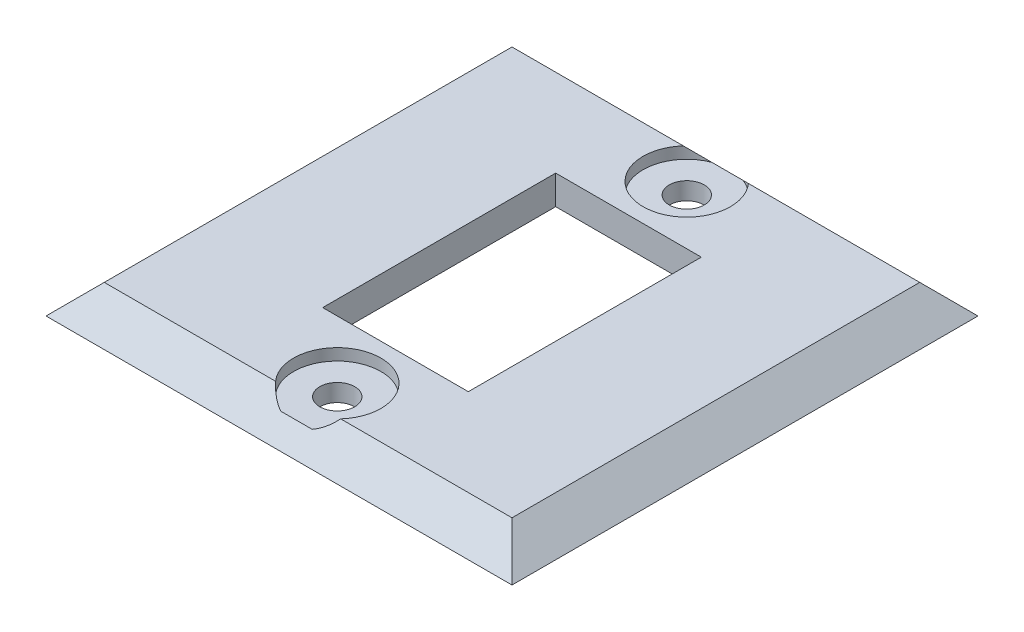
ISO-10303-21;
HEADER;
FILE_DESCRIPTION(('STEP AP214'),'2;1');
FILE_NAME('part.step','',(''),(''),'','','');
FILE_SCHEMA(('AUTOMOTIVE_DESIGN { 1 0 10303 214 1 1 1 1 }'));
ENDSEC;
DATA;
#1=APPLICATION_CONTEXT('core data for automotive mechanical design processes');
#2=APPLICATION_PROTOCOL_DEFINITION('international standard','automotive_design',2000,#1);
#3=PRODUCT_CONTEXT('',#1,'mechanical');
#4=PRODUCT('Part','Part','',(#3));
#5=PRODUCT_RELATED_PRODUCT_CATEGORY('part','',(#4));
#6=PRODUCT_DEFINITION_FORMATION('','',#4);
#7=PRODUCT_DEFINITION_CONTEXT('part definition',#1,'design');
#8=PRODUCT_DEFINITION('design','',#6,#7);
#9=PRODUCT_DEFINITION_SHAPE('','',#8);
#10=(LENGTH_UNIT() NAMED_UNIT(*) SI_UNIT(.MILLI.,.METRE.));
#11=(NAMED_UNIT(*) PLANE_ANGLE_UNIT() SI_UNIT($,.RADIAN.));
#12=(NAMED_UNIT(*) SI_UNIT($,.STERADIAN.) SOLID_ANGLE_UNIT());
#13=UNCERTAINTY_MEASURE_WITH_UNIT(LENGTH_MEASURE(1.E-05),#10,'distance_accuracy_value','');
#14=(GEOMETRIC_REPRESENTATION_CONTEXT(3) GLOBAL_UNCERTAINTY_ASSIGNED_CONTEXT((#13)) GLOBAL_UNIT_ASSIGNED_CONTEXT((#10,
#11,#12)) REPRESENTATION_CONTEXT('',''));
#15=CARTESIAN_POINT('',(0.,0.,0.));
#16=DIRECTION('',(0.,0.,1.));
#17=DIRECTION('',(1.,0.,0.));
#18=AXIS2_PLACEMENT_3D('',#15,#16,#17);
#19=CARTESIAN_POINT('',(0.,-7.5,15.));
#20=DIRECTION('',(0.,1.,0.));
#21=DIRECTION('',(0.,0.,1.));
#22=AXIS2_PLACEMENT_3D('',#19,#20,#21);
#23=CYLINDRICAL_SURFACE('',#22,1.5);
#24=CARTESIAN_POINT('',(0.,0.,15.));
#25=DIRECTION('',(0.,1.,0.));
#26=DIRECTION('',(0.,0.,1.));
#27=AXIS2_PLACEMENT_3D('',#24,#25,#26);
#28=CIRCLE('',#27,1.5);
#29=CARTESIAN_POINT('',(0.,0.,16.5));
#30=VERTEX_POINT('',#29);
#31=EDGE_CURVE('E183',#30,#30,#28,.T.);
#32=ORIENTED_EDGE('',*,*,#31,.F.);
#33=EDGE_LOOP('',(#32));
#34=FACE_BOUND('',#33,.T.);
#35=CARTESIAN_POINT('',(0.,1.5,15.));
#36=DIRECTION('',(0.,1.,0.));
#37=DIRECTION('',(0.,0.,1.));
#38=AXIS2_PLACEMENT_3D('',#35,#36,#37);
#39=CIRCLE('',#38,1.5);
#40=CARTESIAN_POINT('',(0.,1.5,16.5));
#41=VERTEX_POINT('',#40);
#42=EDGE_CURVE('E190',#41,#41,#39,.F.);
#43=ORIENTED_EDGE('',*,*,#42,.F.);
#44=EDGE_LOOP('',(#43));
#45=FACE_BOUND('',#44,.T.);
#46=ADVANCED_FACE('F35',(#34,#45),#23,.F.);
#47=CARTESIAN_POINT('',(0.,-7.5,-15.));
#48=DIRECTION('',(0.,1.,0.));
#49=DIRECTION('',(0.,0.,1.));
#50=AXIS2_PLACEMENT_3D('',#47,#48,#49);
#51=CYLINDRICAL_SURFACE('',#50,1.5);
#52=CARTESIAN_POINT('',(0.,0.,-15.));
#53=DIRECTION('',(0.,1.,0.));
#54=DIRECTION('',(0.,0.,1.));
#55=AXIS2_PLACEMENT_3D('',#52,#53,#54);
#56=CIRCLE('',#55,1.5);
#57=CARTESIAN_POINT('',(0.,0.,-13.5));
#58=VERTEX_POINT('',#57);
#59=EDGE_CURVE('E158',#58,#58,#56,.T.);
#60=ORIENTED_EDGE('',*,*,#59,.F.);
#61=EDGE_LOOP('',(#60));
#62=FACE_BOUND('',#61,.T.);
#63=CARTESIAN_POINT('',(0.,1.5,-15.));
#64=DIRECTION('',(0.,1.,0.));
#65=DIRECTION('',(0.,0.,1.));
#66=AXIS2_PLACEMENT_3D('',#63,#64,#65);
#67=CIRCLE('',#66,1.5);
#68=CARTESIAN_POINT('',(0.,1.5,-13.5));
#69=VERTEX_POINT('',#68);
#70=EDGE_CURVE('E186',#69,#69,#67,.F.);
#71=ORIENTED_EDGE('',*,*,#70,.F.);
#72=EDGE_LOOP('',(#71));
#73=FACE_BOUND('',#72,.T.);
#74=ADVANCED_FACE('F277',(#62,#73),#51,.F.);
#75=CARTESIAN_POINT('',(0.,2.5,0.));
#76=DIRECTION('',(0.,1.,0.));
#77=DIRECTION('',(0.,0.,1.));
#78=AXIS2_PLACEMENT_3D('',#75,#76,#77);
#79=PLANE('',#78);
#80=CARTESIAN_POINT('',(0.,2.5,15.));
#81=DIRECTION('',(0.,1.,0.));
#82=DIRECTION('',(0.,0.,1.));
#83=AXIS2_PLACEMENT_3D('',#80,#81,#82);
#84=CIRCLE('',#83,3.75);
#85=CARTESIAN_POINT('',(2.79508497187475,2.5,17.5));
#86=VERTEX_POINT('',#85);
#87=CARTESIAN_POINT('',(-2.79508497187475,2.5,17.5));
#88=VERTEX_POINT('',#87);
#89=EDGE_CURVE('E225',#86,#88,#84,.T.);
#90=ORIENTED_EDGE('',*,*,#89,.F.);
#91=DIRECTION('',(1.,0.,0.));
#92=VECTOR('',#91,1.);
#93=CARTESIAN_POINT('',(-20.,2.5,17.5));
#94=LINE('',#93,#92);
#95=CARTESIAN_POINT('',(17.5,2.5,17.5));
#96=VERTEX_POINT('',#95);
#97=EDGE_CURVE('E205',#86,#96,#94,.T.);
#98=ORIENTED_EDGE('',*,*,#97,.T.);
#99=DIRECTION('',(0.,0.,-1.));
#100=VECTOR('',#99,1.);
#101=CARTESIAN_POINT('',(17.5,2.5,-20.));
#102=LINE('',#101,#100);
#103=CARTESIAN_POINT('',(17.5,2.5,-17.5));
#104=VERTEX_POINT('',#103);
#105=EDGE_CURVE('E202',#96,#104,#102,.T.);
#106=ORIENTED_EDGE('',*,*,#105,.T.);
#107=DIRECTION('',(-1.,0.,0.));
#108=VECTOR('',#107,1.);
#109=CARTESIAN_POINT('',(20.,2.5,-17.5));
#110=LINE('',#109,#108);
#111=CARTESIAN_POINT('',(2.79508497187474,2.5,-17.5));
#112=VERTEX_POINT('',#111);
#113=EDGE_CURVE('E200',#104,#112,#110,.T.);
#114=ORIENTED_EDGE('',*,*,#113,.T.);
#115=CARTESIAN_POINT('',(0.,2.5,-15.));
#116=DIRECTION('',(0.,1.,0.));
#117=DIRECTION('',(0.,0.,1.));
#118=AXIS2_PLACEMENT_3D('',#115,#116,#117);
#119=CIRCLE('',#118,3.75);
#120=CARTESIAN_POINT('',(-2.79508497187474,2.5,-17.5));
#121=VERTEX_POINT('',#120);
#122=EDGE_CURVE('E193',#121,#112,#119,.T.);
#123=ORIENTED_EDGE('',*,*,#122,.F.);
#124=DIRECTION('',(-1.,0.,0.));
#125=VECTOR('',#124,1.);
#126=CARTESIAN_POINT('',(20.,2.5,-17.5));
#127=LINE('',#126,#125);
#128=CARTESIAN_POINT('',(-17.5,2.5,-17.5));
#129=VERTEX_POINT('',#128);
#130=EDGE_CURVE('E196',#121,#129,#127,.T.);
#131=ORIENTED_EDGE('',*,*,#130,.T.);
#132=DIRECTION('',(0.,0.,1.));
#133=VECTOR('',#132,1.);
#134=CARTESIAN_POINT('',(-17.5,2.5,20.));
#135=LINE('',#134,#133);
#136=CARTESIAN_POINT('',(-17.5,2.5,17.5));
#137=VERTEX_POINT('',#136);
#138=EDGE_CURVE('E180',#129,#137,#135,.T.);
#139=ORIENTED_EDGE('',*,*,#138,.T.);
#140=DIRECTION('',(1.,0.,0.));
#141=VECTOR('',#140,1.);
#142=CARTESIAN_POINT('',(-20.,2.5,17.5));
#143=LINE('',#142,#141);
#144=EDGE_CURVE('E198',#137,#88,#143,.T.);
#145=ORIENTED_EDGE('',*,*,#144,.T.);
#146=EDGE_LOOP('',(#90,#98,#106,#114,#123,#131,#139,#145));
#147=FACE_BOUND('',#146,.T.);
#148=DIRECTION('',(1.,0.,0.));
#149=VECTOR('',#148,1.);
#150=CARTESIAN_POINT('',(-6.25,2.5,10.));
#151=LINE('',#150,#149);
#152=CARTESIAN_POINT('',(-6.25,2.5,10.));
#153=VERTEX_POINT('',#152);
#154=CARTESIAN_POINT('',(6.25,2.5,10.));
#155=VERTEX_POINT('',#154);
#156=EDGE_CURVE('E135',#153,#155,#151,.T.);
#157=ORIENTED_EDGE('',*,*,#156,.F.);
#158=DIRECTION('',(0.,0.,1.));
#159=VECTOR('',#158,1.);
#160=CARTESIAN_POINT('',(-6.25,2.5,-10.));
#161=LINE('',#160,#159);
#162=CARTESIAN_POINT('',(-6.25,2.5,-10.));
#163=VERTEX_POINT('',#162);
#164=EDGE_CURVE('E125',#163,#153,#161,.T.);
#165=ORIENTED_EDGE('',*,*,#164,.F.);
#166=DIRECTION('',(-1.,0.,0.));
#167=VECTOR('',#166,1.);
#168=CARTESIAN_POINT('',(-6.25,2.5,-10.));
#169=LINE('',#168,#167);
#170=CARTESIAN_POINT('',(6.25,2.5,-10.));
#171=VERTEX_POINT('',#170);
#172=EDGE_CURVE('E151',#171,#163,#169,.T.);
#173=ORIENTED_EDGE('',*,*,#172,.F.);
#174=DIRECTION('',(0.,0.,-1.));
#175=VECTOR('',#174,1.);
#176=CARTESIAN_POINT('',(6.25,2.5,-10.));
#177=LINE('',#176,#175);
#178=EDGE_CURVE('E149',#155,#171,#177,.T.);
#179=ORIENTED_EDGE('',*,*,#178,.F.);
#180=EDGE_LOOP('',(#157,#165,#173,#179));
#181=FACE_BOUND('',#180,.T.);
#182=ADVANCED_FACE('F147',(#147,#181),#79,.T.);
#183=CARTESIAN_POINT('',(0.,0.,0.));
#184=DIRECTION('',(0.,1.,0.));
#185=DIRECTION('',(0.,0.,1.));
#186=AXIS2_PLACEMENT_3D('',#183,#184,#185);
#187=PLANE('',#186);
#188=ORIENTED_EDGE('',*,*,#31,.T.);
#189=EDGE_LOOP('',(#188));
#190=FACE_BOUND('',#189,.T.);
#191=ORIENTED_EDGE('',*,*,#59,.T.);
#192=EDGE_LOOP('',(#191));
#193=FACE_BOUND('',#192,.T.);
#194=DIRECTION('',(0.,0.,1.));
#195=VECTOR('',#194,1.);
#196=CARTESIAN_POINT('',(-20.,0.,-20.));
#197=LINE('',#196,#195);
#198=CARTESIAN_POINT('',(-20.,0.,-20.));
#199=VERTEX_POINT('',#198);
#200=CARTESIAN_POINT('',(-20.,0.,20.));
#201=VERTEX_POINT('',#200);
#202=EDGE_CURVE('E143',#199,#201,#197,.T.);
#203=ORIENTED_EDGE('',*,*,#202,.F.);
#204=DIRECTION('',(-1.,0.,0.));
#205=VECTOR('',#204,1.);
#206=CARTESIAN_POINT('',(-20.,0.,-20.));
#207=LINE('',#206,#205);
#208=CARTESIAN_POINT('',(20.,0.,-20.));
#209=VERTEX_POINT('',#208);
#210=EDGE_CURVE('E177',#209,#199,#207,.T.);
#211=ORIENTED_EDGE('',*,*,#210,.F.);
#212=DIRECTION('',(0.,0.,-1.));
#213=VECTOR('',#212,1.);
#214=CARTESIAN_POINT('',(20.,0.,-20.));
#215=LINE('',#214,#213);
#216=CARTESIAN_POINT('',(20.,0.,20.));
#217=VERTEX_POINT('',#216);
#218=EDGE_CURVE('E174',#217,#209,#215,.T.);
#219=ORIENTED_EDGE('',*,*,#218,.F.);
#220=DIRECTION('',(1.,0.,0.));
#221=VECTOR('',#220,1.);
#222=CARTESIAN_POINT('',(-20.,0.,20.));
#223=LINE('',#222,#221);
#224=EDGE_CURVE('E171',#201,#217,#223,.T.);
#225=ORIENTED_EDGE('',*,*,#224,.F.);
#226=EDGE_LOOP('',(#203,#211,#219,#225));
#227=FACE_BOUND('',#226,.T.);
#228=DIRECTION('',(0.,0.,1.));
#229=VECTOR('',#228,1.);
#230=CARTESIAN_POINT('',(-6.25,0.,-10.));
#231=LINE('',#230,#229);
#232=CARTESIAN_POINT('',(-6.25,0.,-10.));
#233=VERTEX_POINT('',#232);
#234=CARTESIAN_POINT('',(-6.25,0.,10.));
#235=VERTEX_POINT('',#234);
#236=EDGE_CURVE('E156',#233,#235,#231,.T.);
#237=ORIENTED_EDGE('',*,*,#236,.T.);
#238=DIRECTION('',(1.,0.,0.));
#239=VECTOR('',#238,1.);
#240=CARTESIAN_POINT('',(-6.25,0.,10.));
#241=LINE('',#240,#239);
#242=CARTESIAN_POINT('',(6.25,0.,10.));
#243=VERTEX_POINT('',#242);
#244=EDGE_CURVE('E142',#235,#243,#241,.T.);
#245=ORIENTED_EDGE('',*,*,#244,.T.);
#246=DIRECTION('',(0.,0.,-1.));
#247=VECTOR('',#246,1.);
#248=CARTESIAN_POINT('',(6.25,0.,-10.));
#249=LINE('',#248,#247);
#250=CARTESIAN_POINT('',(6.25,0.,-10.));
#251=VERTEX_POINT('',#250);
#252=EDGE_CURVE('E160',#243,#251,#249,.T.);
#253=ORIENTED_EDGE('',*,*,#252,.T.);
#254=DIRECTION('',(-1.,0.,0.));
#255=VECTOR('',#254,1.);
#256=CARTESIAN_POINT('',(-6.25,0.,-10.));
#257=LINE('',#256,#255);
#258=EDGE_CURVE('E136',#251,#233,#257,.T.);
#259=ORIENTED_EDGE('',*,*,#258,.T.);
#260=EDGE_LOOP('',(#237,#245,#253,#259));
#261=FACE_BOUND('',#260,.T.);
#262=ADVANCED_FACE('F256',(#190,#193,#227,#261),#187,.F.);
#263=CARTESIAN_POINT('',(-6.25,2.5,-10.));
#264=DIRECTION('',(1.,0.,0.));
#265=DIRECTION('',(0.,0.,-1.));
#266=AXIS2_PLACEMENT_3D('',#263,#264,#265);
#267=PLANE('',#266);
#268=ORIENTED_EDGE('',*,*,#236,.F.);
#269=DIRECTION('',(0.,-1.,0.));
#270=VECTOR('',#269,1.);
#271=CARTESIAN_POINT('',(-6.25,2.5,-10.));
#272=LINE('',#271,#270);
#273=EDGE_CURVE('E131',#163,#233,#272,.T.);
#274=ORIENTED_EDGE('',*,*,#273,.F.);
#275=ORIENTED_EDGE('',*,*,#164,.T.);
#276=DIRECTION('',(0.,-1.,0.));
#277=VECTOR('',#276,1.);
#278=CARTESIAN_POINT('',(-6.25,2.5,10.));
#279=LINE('',#278,#277);
#280=EDGE_CURVE('E128',#153,#235,#279,.T.);
#281=ORIENTED_EDGE('',*,*,#280,.T.);
#282=EDGE_LOOP('',(#268,#274,#275,#281));
#283=FACE_BOUND('',#282,.T.);
#284=ADVANCED_FACE('F127',(#283),#267,.T.);
#285=CARTESIAN_POINT('',(-6.25,2.5,10.));
#286=DIRECTION('',(0.,0.,-1.));
#287=DIRECTION('',(-1.,0.,0.));
#288=AXIS2_PLACEMENT_3D('',#285,#286,#287);
#289=PLANE('',#288);
#290=ORIENTED_EDGE('',*,*,#244,.F.);
#291=ORIENTED_EDGE('',*,*,#280,.F.);
#292=ORIENTED_EDGE('',*,*,#156,.T.);
#293=DIRECTION('',(0.,-1.,0.));
#294=VECTOR('',#293,1.);
#295=CARTESIAN_POINT('',(6.25,2.5,10.));
#296=LINE('',#295,#294);
#297=EDGE_CURVE('E144',#155,#243,#296,.T.);
#298=ORIENTED_EDGE('',*,*,#297,.T.);
#299=EDGE_LOOP('',(#290,#291,#292,#298));
#300=FACE_BOUND('',#299,.T.);
#301=ADVANCED_FACE('F139',(#300),#289,.T.);
#302=CARTESIAN_POINT('',(6.25,2.5,-10.));
#303=DIRECTION('',(-1.,0.,0.));
#304=DIRECTION('',(0.,0.,1.));
#305=AXIS2_PLACEMENT_3D('',#302,#303,#304);
#306=PLANE('',#305);
#307=ORIENTED_EDGE('',*,*,#252,.F.);
#308=ORIENTED_EDGE('',*,*,#297,.F.);
#309=ORIENTED_EDGE('',*,*,#178,.T.);
#310=DIRECTION('',(0.,-1.,0.));
#311=VECTOR('',#310,1.);
#312=CARTESIAN_POINT('',(6.25,2.5,-10.));
#313=LINE('',#312,#311);
#314=EDGE_CURVE('E166',#171,#251,#313,.T.);
#315=ORIENTED_EDGE('',*,*,#314,.T.);
#316=EDGE_LOOP('',(#307,#308,#309,#315));
#317=FACE_BOUND('',#316,.T.);
#318=ADVANCED_FACE('F266',(#317),#306,.T.);
#319=CARTESIAN_POINT('',(-6.25,2.5,-10.));
#320=DIRECTION('',(0.,0.,1.));
#321=DIRECTION('',(1.,0.,0.));
#322=AXIS2_PLACEMENT_3D('',#319,#320,#321);
#323=PLANE('',#322);
#324=ORIENTED_EDGE('',*,*,#258,.F.);
#325=ORIENTED_EDGE('',*,*,#314,.F.);
#326=ORIENTED_EDGE('',*,*,#172,.T.);
#327=ORIENTED_EDGE('',*,*,#273,.T.);
#328=EDGE_LOOP('',(#324,#325,#326,#327));
#329=FACE_BOUND('',#328,.T.);
#330=ADVANCED_FACE('F263',(#329),#323,.T.);
#331=CARTESIAN_POINT('',(0.,1.5,-15.));
#332=DIRECTION('',(0.,1.,0.));
#333=DIRECTION('',(0.,0.,1.));
#334=AXIS2_PLACEMENT_3D('',#331,#332,#333);
#335=PLANE('',#334);
#336=CARTESIAN_POINT('',(0.,1.5,-15.));
#337=DIRECTION('',(0.,1.,0.));
#338=DIRECTION('',(0.,0.,1.));
#339=AXIS2_PLACEMENT_3D('',#336,#337,#338);
#340=CIRCLE('',#339,3.75);
#341=CARTESIAN_POINT('',(-1.34629120178364,1.5,-18.5));
#342=VERTEX_POINT('',#341);
#343=CARTESIAN_POINT('',(1.34629120178364,1.5,-18.5));
#344=VERTEX_POINT('',#343);
#345=EDGE_CURVE('E189',#342,#344,#340,.T.);
#346=ORIENTED_EDGE('',*,*,#345,.T.);
#347=DIRECTION('',(-1.,0.,0.));
#348=VECTOR('',#347,1.);
#349=CARTESIAN_POINT('',(0.,1.5,-18.5));
#350=LINE('',#349,#348);
#351=EDGE_CURVE('E11',#344,#342,#350,.T.);
#352=ORIENTED_EDGE('',*,*,#351,.T.);
#353=EDGE_LOOP('',(#346,#352));
#354=FACE_BOUND('',#353,.T.);
#355=ORIENTED_EDGE('',*,*,#70,.T.);
#356=EDGE_LOOP('',(#355));
#357=FACE_BOUND('',#356,.T.);
#358=ADVANCED_FACE('F273',(#354,#357),#335,.T.);
#359=CARTESIAN_POINT('',(0.,1.5,-15.));
#360=DIRECTION('',(0.,1.,0.));
#361=DIRECTION('',(0.,0.,1.));
#362=AXIS2_PLACEMENT_3D('',#359,#360,#361);
#363=CYLINDRICAL_SURFACE('',#362,3.75);
#364=ORIENTED_EDGE('',*,*,#122,.T.);
#365=CARTESIAN_POINT('',(0.,5.,-15.));
#366=DIRECTION('',(0.,0.707106781186547,-0.707106781186547));
#367=DIRECTION('',(0.,0.707106781186548,0.707106781186548));
#368=AXIS2_PLACEMENT_3D('',#365,#366,#367);
#369=ELLIPSE('',#368,5.30330085889911,3.75);
#370=EDGE_CURVE('E44',#112,#344,#369,.T.);
#371=ORIENTED_EDGE('',*,*,#370,.T.);
#372=ORIENTED_EDGE('',*,*,#345,.F.);
#373=CARTESIAN_POINT('',(0.,5.,-15.));
#374=DIRECTION('',(0.,0.707106781186547,-0.707106781186547));
#375=DIRECTION('',(0.,0.707106781186548,0.707106781186548));
#376=AXIS2_PLACEMENT_3D('',#373,#374,#375);
#377=ELLIPSE('',#376,5.30330085889911,3.75);
#378=EDGE_CURVE('E213',#342,#121,#377,.T.);
#379=ORIENTED_EDGE('',*,*,#378,.T.);
#380=EDGE_LOOP('',(#364,#371,#372,#379));
#381=FACE_BOUND('',#380,.T.);
#382=ADVANCED_FACE('F238',(#381),#363,.F.);
#383=CARTESIAN_POINT('',(0.,1.5,15.));
#384=DIRECTION('',(0.,1.,0.));
#385=DIRECTION('',(0.,0.,1.));
#386=AXIS2_PLACEMENT_3D('',#383,#384,#385);
#387=PLANE('',#386);
#388=CARTESIAN_POINT('',(0.,1.5,15.));
#389=DIRECTION('',(0.,1.,0.));
#390=DIRECTION('',(0.,0.,1.));
#391=AXIS2_PLACEMENT_3D('',#388,#389,#390);
#392=CIRCLE('',#391,3.75);
#393=CARTESIAN_POINT('',(1.34629120178366,1.5,18.5));
#394=VERTEX_POINT('',#393);
#395=CARTESIAN_POINT('',(-1.34629120178365,1.5,18.5));
#396=VERTEX_POINT('',#395);
#397=EDGE_CURVE('E194',#394,#396,#392,.T.);
#398=ORIENTED_EDGE('',*,*,#397,.T.);
#399=DIRECTION('',(1.,0.,0.));
#400=VECTOR('',#399,1.);
#401=CARTESIAN_POINT('',(0.,1.5,18.5));
#402=LINE('',#401,#400);
#403=EDGE_CURVE('E211',#396,#394,#402,.T.);
#404=ORIENTED_EDGE('',*,*,#403,.T.);
#405=EDGE_LOOP('',(#398,#404));
#406=FACE_BOUND('',#405,.T.);
#407=ORIENTED_EDGE('',*,*,#42,.T.);
#408=EDGE_LOOP('',(#407));
#409=FACE_BOUND('',#408,.T.);
#410=ADVANCED_FACE('F290',(#406,#409),#387,.T.);
#411=CARTESIAN_POINT('',(0.,1.5,15.));
#412=DIRECTION('',(0.,1.,0.));
#413=DIRECTION('',(0.,0.,1.));
#414=AXIS2_PLACEMENT_3D('',#411,#412,#413);
#415=CYLINDRICAL_SURFACE('',#414,3.75);
#416=ORIENTED_EDGE('',*,*,#89,.T.);
#417=CARTESIAN_POINT('',(0.,4.99999999999999,15.));
#418=DIRECTION('',(0.,0.707106781186547,0.707106781186547));
#419=DIRECTION('',(0.,0.707106781186548,-0.707106781186548));
#420=AXIS2_PLACEMENT_3D('',#417,#418,#419);
#421=ELLIPSE('',#420,5.30330085889911,3.75);
#422=EDGE_CURVE('E209',#88,#396,#421,.T.);
#423=ORIENTED_EDGE('',*,*,#422,.T.);
#424=ORIENTED_EDGE('',*,*,#397,.F.);
#425=CARTESIAN_POINT('',(0.,4.99999999999999,15.));
#426=DIRECTION('',(0.,0.707106781186547,0.707106781186547));
#427=DIRECTION('',(0.,0.707106781186548,-0.707106781186548));
#428=AXIS2_PLACEMENT_3D('',#425,#426,#427);
#429=ELLIPSE('',#428,5.30330085889911,3.75);
#430=EDGE_CURVE('E207',#394,#86,#429,.T.);
#431=ORIENTED_EDGE('',*,*,#430,.T.);
#432=EDGE_LOOP('',(#416,#423,#424,#431));
#433=FACE_BOUND('',#432,.T.);
#434=ADVANCED_FACE('F293',(#433),#415,.F.);
#435=CARTESIAN_POINT('',(-17.5,2.5,0.));
#436=DIRECTION('',(-0.707106781186549,0.707106781186545,0.));
#437=DIRECTION('',(0.,0.,-1.));
#438=AXIS2_PLACEMENT_3D('',#435,#436,#437);
#439=PLANE('',#438);
#440=DIRECTION('',(-0.577350269189624,-0.577350269189627,-0.577350269189627));
#441=VECTOR('',#440,1.);
#442=CARTESIAN_POINT('',(-11.6666666666667,8.33333333333335,-11.6666666666666));
#443=LINE('',#442,#441);
#444=EDGE_CURVE('E219',#199,#129,#443,.F.);
#445=ORIENTED_EDGE('',*,*,#444,.F.);
#446=ORIENTED_EDGE('',*,*,#202,.T.);
#447=DIRECTION('',(0.577350269189624,0.577350269189627,-0.577350269189627));
#448=VECTOR('',#447,1.);
#449=CARTESIAN_POINT('',(-11.6666666666667,8.33333333333335,11.6666666666666));
#450=LINE('',#449,#448);
#451=EDGE_CURVE('E39',#137,#201,#450,.F.);
#452=ORIENTED_EDGE('',*,*,#451,.F.);
#453=ORIENTED_EDGE('',*,*,#138,.F.);
#454=EDGE_LOOP('',(#445,#446,#452,#453));
#455=FACE_BOUND('',#454,.T.);
#456=ADVANCED_FACE('F37',(#455),#439,.T.);
#457=CARTESIAN_POINT('',(0.,2.5,17.5));
#458=DIRECTION('',(0.,0.707106781186547,0.707106781186547));
#459=DIRECTION('',(-1.,0.,0.));
#460=AXIS2_PLACEMENT_3D('',#457,#458,#459);
#461=PLANE('',#460);
#462=ORIENTED_EDGE('',*,*,#451,.T.);
#463=ORIENTED_EDGE('',*,*,#224,.T.);
#464=DIRECTION('',(-0.577350269189624,0.577350269189627,-0.577350269189627));
#465=VECTOR('',#464,1.);
#466=CARTESIAN_POINT('',(11.6666666666667,8.33333333333332,11.6666666666667));
#467=LINE('',#466,#465);
#468=EDGE_CURVE('E218',#96,#217,#467,.F.);
#469=ORIENTED_EDGE('',*,*,#468,.F.);
#470=ORIENTED_EDGE('',*,*,#97,.F.);
#471=ORIENTED_EDGE('',*,*,#430,.F.);
#472=ORIENTED_EDGE('',*,*,#403,.F.);
#473=ORIENTED_EDGE('',*,*,#422,.F.);
#474=ORIENTED_EDGE('',*,*,#144,.F.);
#475=EDGE_LOOP('',(#462,#463,#469,#470,#471,#472,#473,#474));
#476=FACE_BOUND('',#475,.T.);
#477=ADVANCED_FACE('F246',(#476),#461,.T.);
#478=CARTESIAN_POINT('',(0.,2.5,-17.5));
#479=DIRECTION('',(0.,0.707106781186547,-0.707106781186547));
#480=DIRECTION('',(1.,0.,0.));
#481=AXIS2_PLACEMENT_3D('',#478,#479,#480);
#482=PLANE('',#481);
#483=ORIENTED_EDGE('',*,*,#370,.F.);
#484=ORIENTED_EDGE('',*,*,#113,.F.);
#485=DIRECTION('',(0.577350269189624,-0.577350269189627,-0.577350269189627));
#486=VECTOR('',#485,1.);
#487=CARTESIAN_POINT('',(11.6666666666667,8.33333333333332,-11.6666666666667));
#488=LINE('',#487,#486);
#489=EDGE_CURVE('E216',#209,#104,#488,.F.);
#490=ORIENTED_EDGE('',*,*,#489,.F.);
#491=ORIENTED_EDGE('',*,*,#210,.T.);
#492=ORIENTED_EDGE('',*,*,#444,.T.);
#493=ORIENTED_EDGE('',*,*,#130,.F.);
#494=ORIENTED_EDGE('',*,*,#378,.F.);
#495=ORIENTED_EDGE('',*,*,#351,.F.);
#496=EDGE_LOOP('',(#483,#484,#490,#491,#492,#493,#494,#495));
#497=FACE_BOUND('',#496,.T.);
#498=ADVANCED_FACE('F242',(#497),#482,.T.);
#499=CARTESIAN_POINT('',(17.5,2.5,0.));
#500=DIRECTION('',(0.707106781186549,0.707106781186545,0.));
#501=DIRECTION('',(0.,0.,1.));
#502=AXIS2_PLACEMENT_3D('',#499,#500,#501);
#503=PLANE('',#502);
#504=ORIENTED_EDGE('',*,*,#468,.T.);
#505=ORIENTED_EDGE('',*,*,#218,.T.);
#506=ORIENTED_EDGE('',*,*,#489,.T.);
#507=ORIENTED_EDGE('',*,*,#105,.F.);
#508=EDGE_LOOP('',(#504,#505,#506,#507));
#509=FACE_BOUND('',#508,.T.);
#510=ADVANCED_FACE('F254',(#509),#503,.T.);
#511=CLOSED_SHELL('',(#46,#74,#182,#262,#284,#301,#318,#330,#358,#382,#410,#434,#456,#477,#498,#510));
#512=MANIFOLD_SOLID_BREP('B2',#511);
#513=ADVANCED_BREP_SHAPE_REPRESENTATION('',(#18,#512),#14);
#514=SHAPE_DEFINITION_REPRESENTATION(#9,#513);
ENDSEC;
END-ISO-10303-21;
